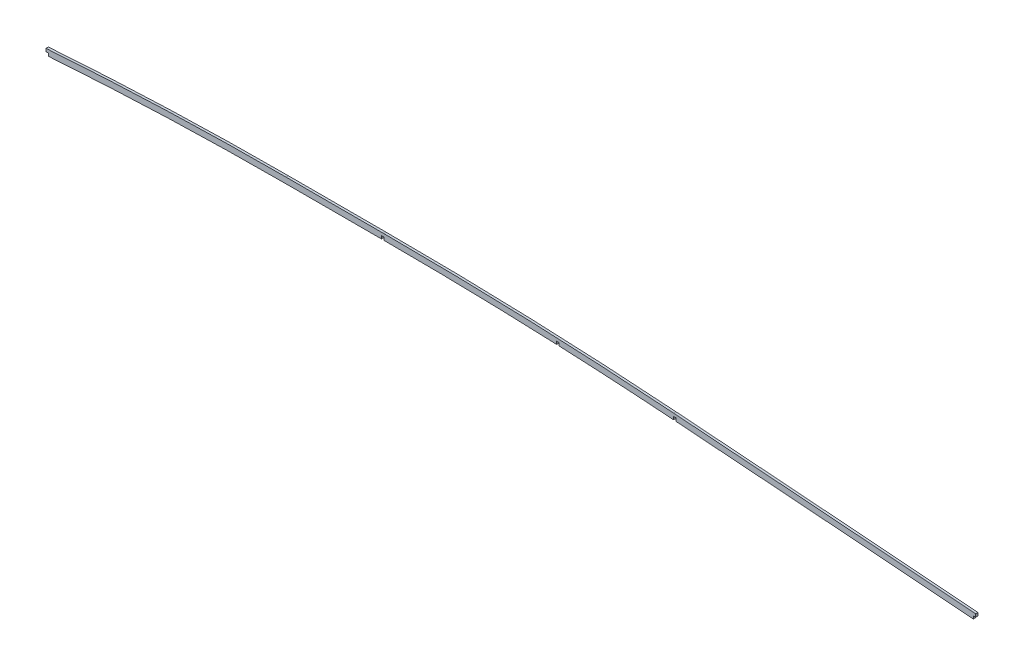
ISO-10303-21;
HEADER;
FILE_DESCRIPTION(('STEP AP214'),'2;1');
FILE_NAME('part.step','',(''),(''),'','','');
FILE_SCHEMA(('AUTOMOTIVE_DESIGN { 1 0 10303 214 1 1 1 1 }'));
ENDSEC;
DATA;
#1=APPLICATION_CONTEXT('core data for automotive mechanical design processes');
#2=APPLICATION_PROTOCOL_DEFINITION('international standard','automotive_design',2000,#1);
#3=PRODUCT_CONTEXT('',#1,'mechanical');
#4=PRODUCT('Part','Part','',(#3));
#5=PRODUCT_RELATED_PRODUCT_CATEGORY('part','',(#4));
#6=PRODUCT_DEFINITION_FORMATION('','',#4);
#7=PRODUCT_DEFINITION_CONTEXT('part definition',#1,'design');
#8=PRODUCT_DEFINITION('design','',#6,#7);
#9=PRODUCT_DEFINITION_SHAPE('','',#8);
#10=(LENGTH_UNIT() NAMED_UNIT(*) SI_UNIT(.MILLI.,.METRE.));
#11=(NAMED_UNIT(*) PLANE_ANGLE_UNIT() SI_UNIT($,.RADIAN.));
#12=(NAMED_UNIT(*) SI_UNIT($,.STERADIAN.) SOLID_ANGLE_UNIT());
#13=UNCERTAINTY_MEASURE_WITH_UNIT(LENGTH_MEASURE(1.E-05),#10,'distance_accuracy_value','');
#14=(GEOMETRIC_REPRESENTATION_CONTEXT(3) GLOBAL_UNCERTAINTY_ASSIGNED_CONTEXT((#13)) GLOBAL_UNIT_ASSIGNED_CONTEXT((#10,
#11,#12)) REPRESENTATION_CONTEXT('',''));
#15=CARTESIAN_POINT('',(0.,0.,0.));
#16=DIRECTION('',(0.,0.,1.));
#17=DIRECTION('',(1.,0.,0.));
#18=AXIS2_PLACEMENT_3D('',#15,#16,#17);
#19=CARTESIAN_POINT('',(418.470256951652,-14187.600562427,10.));
#20=DIRECTION('',(0.,0.,-1.));
#21=DIRECTION('',(-1.,0.,0.));
#22=AXIS2_PLACEMENT_3D('',#19,#20,#21);
#23=CYLINDRICAL_SURFACE('',#22,14481.0488219717);
#24=CARTESIAN_POINT('',(418.470256951652,-14187.600562427,0.));
#25=DIRECTION('',(0.,0.,1.));
#26=DIRECTION('',(1.,0.,0.));
#27=AXIS2_PLACEMENT_3D('',#24,#25,#26);
#28=CIRCLE('',#27,14481.0488219717);
#29=CARTESIAN_POINT('',(418.470256951648,293.448259544728,0.));
#30=VERTEX_POINT('',#29);
#31=CARTESIAN_POINT('',(-598.870505757318,257.668308620742,0.));
#32=VERTEX_POINT('',#31);
#33=EDGE_CURVE('E248',#30,#32,#28,.T.);
#34=ORIENTED_EDGE('',*,*,#33,.F.);
#35=DIRECTION('',(0.,0.,-1.));
#36=VECTOR('',#35,1.);
#37=CARTESIAN_POINT('',(418.470256951648,293.448259544728,10.));
#38=LINE('',#37,#36);
#39=CARTESIAN_POINT('',(418.470256951648,293.448259544728,10.));
#40=VERTEX_POINT('',#39);
#41=EDGE_CURVE('E11',#40,#30,#38,.T.);
#42=ORIENTED_EDGE('',*,*,#41,.F.);
#43=CARTESIAN_POINT('',(418.470256951652,-14187.600562427,10.));
#44=DIRECTION('',(0.,0.,1.));
#45=DIRECTION('',(1.,0.,0.));
#46=AXIS2_PLACEMENT_3D('',#43,#44,#45);
#47=CIRCLE('',#46,14481.0488219717);
#48=CARTESIAN_POINT('',(-598.870505757318,257.668308620742,10.));
#49=VERTEX_POINT('',#48);
#50=EDGE_CURVE('E336',#40,#49,#47,.T.);
#51=ORIENTED_EDGE('',*,*,#50,.T.);
#52=DIRECTION('',(0.,0.,-1.));
#53=VECTOR('',#52,1.);
#54=CARTESIAN_POINT('',(-598.870505757318,257.668308620742,10.));
#55=LINE('',#54,#53);
#56=EDGE_CURVE('E147',#49,#32,#55,.T.);
#57=ORIENTED_EDGE('',*,*,#56,.T.);
#58=EDGE_LOOP('',(#34,#42,#51,#57));
#59=FACE_BOUND('',#58,.T.);
#60=ADVANCED_FACE('F45',(#59),#23,.F.);
#61=CARTESIAN_POINT('',(1.23344609438863E-11,293.448259544746,10.));
#62=DIRECTION('',(0.,1.,0.));
#63=DIRECTION('',(-1.,0.,0.));
#64=AXIS2_PLACEMENT_3D('',#61,#62,#63);
#65=PLANE('',#64);
#66=DIRECTION('',(1.,0.,0.));
#67=VECTOR('',#66,1.);
#68=CARTESIAN_POINT('',(1.23344609438863E-11,293.448259544746,0.));
#69=LINE('',#68,#67);
#70=CARTESIAN_POINT('',(825.799368379474,293.448259544711,0.));
#71=VERTEX_POINT('',#70);
#72=EDGE_CURVE('E252',#30,#71,#69,.T.);
#73=ORIENTED_EDGE('',*,*,#72,.T.);
#74=DIRECTION('',(0.,0.,-1.));
#75=VECTOR('',#74,1.);
#76=CARTESIAN_POINT('',(825.799368379474,293.448259544711,10.));
#77=LINE('',#76,#75);
#78=CARTESIAN_POINT('',(825.799368379474,293.448259544711,10.));
#79=VERTEX_POINT('',#78);
#80=EDGE_CURVE('E54',#79,#71,#77,.T.);
#81=ORIENTED_EDGE('',*,*,#80,.F.);
#82=DIRECTION('',(1.,0.,0.));
#83=VECTOR('',#82,1.);
#84=CARTESIAN_POINT('',(1.23344609438863E-11,293.448259544746,10.));
#85=LINE('',#84,#83);
#86=EDGE_CURVE('E425',#40,#79,#85,.T.);
#87=ORIENTED_EDGE('',*,*,#86,.F.);
#88=ORIENTED_EDGE('',*,*,#41,.T.);
#89=EDGE_LOOP('',(#73,#81,#87,#88));
#90=FACE_BOUND('',#89,.T.);
#91=ADVANCED_FACE('F413',(#90),#65,.F.);
#92=CARTESIAN_POINT('',(825.79936839803,5.11292998792966E-08,10.));
#93=DIRECTION('',(1.,6.19149176372979E-11,0.));
#94=DIRECTION('',(-6.19149176372979E-11,1.,0.));
#95=AXIS2_PLACEMENT_3D('',#92,#93,#94);
#96=PLANE('',#95);
#97=DIRECTION('',(6.19149176372979E-11,-1.,0.));
#98=VECTOR('',#97,1.);
#99=CARTESIAN_POINT('',(825.79936839803,5.11292998792966E-08,0.));
#100=LINE('',#99,#98);
#101=CARTESIAN_POINT('',(825.799368379087,305.948259544709,0.));
#102=VERTEX_POINT('',#101);
#103=EDGE_CURVE('E256',#102,#71,#100,.T.);
#104=ORIENTED_EDGE('',*,*,#103,.F.);
#105=DIRECTION('',(0.,0.,-1.));
#106=VECTOR('',#105,1.);
#107=CARTESIAN_POINT('',(825.799368379087,305.948259544709,10.));
#108=LINE('',#107,#106);
#109=CARTESIAN_POINT('',(825.799368379087,305.948259544709,10.));
#110=VERTEX_POINT('',#109);
#111=EDGE_CURVE('E401',#110,#102,#108,.T.);
#112=ORIENTED_EDGE('',*,*,#111,.F.);
#113=DIRECTION('',(6.19149176372979E-11,-1.,0.));
#114=VECTOR('',#113,1.);
#115=CARTESIAN_POINT('',(825.79936839803,5.11292998792966E-08,10.));
#116=LINE('',#115,#114);
#117=EDGE_CURVE('E410',#110,#79,#116,.T.);
#118=ORIENTED_EDGE('',*,*,#117,.T.);
#119=ORIENTED_EDGE('',*,*,#80,.T.);
#120=EDGE_LOOP('',(#104,#112,#118,#119));
#121=FACE_BOUND('',#120,.T.);
#122=ADVANCED_FACE('F408',(#121),#96,.T.);
#123=CARTESIAN_POINT('',(1.69835401045267E-12,305.948259544714,10.));
#124=DIRECTION('',(0.,-1.,0.));
#125=DIRECTION('',(1.,0.,0.));
#126=AXIS2_PLACEMENT_3D('',#123,#124,#125);
#127=PLANE('',#126);
#128=DIRECTION('',(-1.,0.,0.));
#129=VECTOR('',#128,1.);
#130=CARTESIAN_POINT('',(1.69835401045267E-12,305.948259544714,0.));
#131=LINE('',#130,#129);
#132=CARTESIAN_POINT('',(835.799368379087,305.948259544709,0.));
#133=VERTEX_POINT('',#132);
#134=EDGE_CURVE('E260',#133,#102,#131,.T.);
#135=ORIENTED_EDGE('',*,*,#134,.F.);
#136=DIRECTION('',(0.,0.,-1.));
#137=VECTOR('',#136,1.);
#138=CARTESIAN_POINT('',(835.799368379087,305.948259544709,10.));
#139=LINE('',#138,#137);
#140=CARTESIAN_POINT('',(835.799368379087,305.948259544709,10.));
#141=VERTEX_POINT('',#140);
#142=EDGE_CURVE('E398',#141,#133,#139,.T.);
#143=ORIENTED_EDGE('',*,*,#142,.F.);
#144=DIRECTION('',(-1.,0.,0.));
#145=VECTOR('',#144,1.);
#146=CARTESIAN_POINT('',(1.69835401045267E-12,305.948259544714,10.));
#147=LINE('',#146,#145);
#148=EDGE_CURVE('E422',#141,#110,#147,.T.);
#149=ORIENTED_EDGE('',*,*,#148,.T.);
#150=ORIENTED_EDGE('',*,*,#111,.T.);
#151=EDGE_LOOP('',(#135,#143,#149,#150));
#152=FACE_BOUND('',#151,.T.);
#153=ADVANCED_FACE('F419',(#152),#127,.T.);
#154=CARTESIAN_POINT('',(835.799368416875,1.03229656087279E-07,10.));
#155=DIRECTION('',(-1.,-1.23510091043514E-10,0.));
#156=DIRECTION('',(1.23510091043514E-10,-1.,0.));
#157=AXIS2_PLACEMENT_3D('',#154,#155,#156);
#158=PLANE('',#157);
#159=DIRECTION('',(-1.23510091043514E-10,1.,0.));
#160=VECTOR('',#159,1.);
#161=CARTESIAN_POINT('',(835.799368416875,1.03229656087279E-07,0.));
#162=LINE('',#161,#160);
#163=CARTESIAN_POINT('',(835.799368380631,293.448259544711,0.));
#164=VERTEX_POINT('',#163);
#165=EDGE_CURVE('E264',#164,#133,#162,.T.);
#166=ORIENTED_EDGE('',*,*,#165,.F.);
#167=DIRECTION('',(0.,0.,-1.));
#168=VECTOR('',#167,1.);
#169=CARTESIAN_POINT('',(835.799368380631,293.448259544711,10.));
#170=LINE('',#169,#168);
#171=CARTESIAN_POINT('',(835.799368380631,293.448259544711,10.));
#172=VERTEX_POINT('',#171);
#173=EDGE_CURVE('E395',#172,#164,#170,.T.);
#174=ORIENTED_EDGE('',*,*,#173,.F.);
#175=DIRECTION('',(-1.23510091043514E-10,1.,0.));
#176=VECTOR('',#175,1.);
#177=CARTESIAN_POINT('',(835.799368416875,1.03229656087279E-07,10.));
#178=LINE('',#177,#176);
#179=EDGE_CURVE('E430',#172,#141,#178,.T.);
#180=ORIENTED_EDGE('',*,*,#179,.T.);
#181=ORIENTED_EDGE('',*,*,#142,.T.);
#182=EDGE_LOOP('',(#166,#174,#180,#181));
#183=FACE_BOUND('',#182,.T.);
#184=ADVANCED_FACE('F588',(#183),#158,.T.);
#185=CARTESIAN_POINT('',(835.799368379862,-16684.7350737885,10.));
#186=DIRECTION('',(0.,0.,-1.));
#187=DIRECTION('',(-1.,0.,0.));
#188=AXIS2_PLACEMENT_3D('',#185,#186,#187);
#189=CYLINDRICAL_SURFACE('',#188,16978.1833333332);
#190=CARTESIAN_POINT('',(835.799368379862,-16684.7350737885,0.));
#191=DIRECTION('',(0.,0.,1.));
#192=DIRECTION('',(1.,0.,0.));
#193=AXIS2_PLACEMENT_3D('',#190,#191,#192);
#194=CIRCLE('',#193,16978.1833333332);
#195=CARTESIAN_POINT('',(1574.72865764231,277.360693119072,0.));
#196=VERTEX_POINT('',#195);
#197=EDGE_CURVE('E268',#196,#164,#194,.T.);
#198=ORIENTED_EDGE('',*,*,#197,.F.);
#199=DIRECTION('',(0.,0.,-1.));
#200=VECTOR('',#199,1.);
#201=CARTESIAN_POINT('',(1574.72865764231,277.360693119072,10.));
#202=LINE('',#201,#200);
#203=CARTESIAN_POINT('',(1574.72865764231,277.360693119072,10.));
#204=VERTEX_POINT('',#203);
#205=EDGE_CURVE('E392',#204,#196,#202,.T.);
#206=ORIENTED_EDGE('',*,*,#205,.F.);
#207=CARTESIAN_POINT('',(835.799368379862,-16684.7350737885,10.));
#208=DIRECTION('',(0.,0.,1.));
#209=DIRECTION('',(1.,0.,0.));
#210=AXIS2_PLACEMENT_3D('',#207,#208,#209);
#211=CIRCLE('',#210,16978.1833333332);
#212=EDGE_CURVE('E437',#204,#172,#211,.T.);
#213=ORIENTED_EDGE('',*,*,#212,.T.);
#214=ORIENTED_EDGE('',*,*,#173,.T.);
#215=EDGE_LOOP('',(#198,#206,#213,#214));
#216=FACE_BOUND('',#215,.T.);
#217=ADVANCED_FACE('F584',(#216),#189,.F.);
#218=CARTESIAN_POINT('',(1574.72865766113,1.06865259071871E-07,10.));
#219=DIRECTION('',(1.,6.78626495758278E-11,0.));
#220=DIRECTION('',(-6.78626495758278E-11,1.,0.));
#221=AXIS2_PLACEMENT_3D('',#218,#219,#220);
#222=PLANE('',#221);
#223=DIRECTION('',(6.78626495758278E-11,-1.,0.));
#224=VECTOR('',#223,1.);
#225=CARTESIAN_POINT('',(1574.72865766113,1.06865259071871E-07,0.));
#226=LINE('',#225,#224);
#227=CARTESIAN_POINT('',(1574.72865764149,289.43426521351,0.));
#228=VERTEX_POINT('',#227);
#229=EDGE_CURVE('E272',#228,#196,#226,.T.);
#230=ORIENTED_EDGE('',*,*,#229,.F.);
#231=DIRECTION('',(0.,0.,-1.));
#232=VECTOR('',#231,1.);
#233=CARTESIAN_POINT('',(1574.72865764149,289.43426521351,10.));
#234=LINE('',#233,#232);
#235=CARTESIAN_POINT('',(1574.72865764149,289.43426521351,10.));
#236=VERTEX_POINT('',#235);
#237=EDGE_CURVE('E389',#236,#228,#234,.T.);
#238=ORIENTED_EDGE('',*,*,#237,.F.);
#239=DIRECTION('',(6.78626495758278E-11,-1.,0.));
#240=VECTOR('',#239,1.);
#241=CARTESIAN_POINT('',(1574.72865766113,1.06865259071871E-07,10.));
#242=LINE('',#241,#240);
#243=EDGE_CURVE('E441',#236,#204,#242,.T.);
#244=ORIENTED_EDGE('',*,*,#243,.T.);
#245=ORIENTED_EDGE('',*,*,#205,.T.);
#246=EDGE_LOOP('',(#230,#238,#244,#245));
#247=FACE_BOUND('',#246,.T.);
#248=ADVANCED_FACE('F580',(#247),#222,.T.);
#249=CARTESIAN_POINT('',(0.,289.43426521351,10.));
#250=DIRECTION('',(0.,-1.,0.));
#251=DIRECTION('',(0.,0.,-1.));
#252=AXIS2_PLACEMENT_3D('',#249,#250,#251);
#253=PLANE('',#252);
#254=DIRECTION('',(-1.,0.,0.));
#255=VECTOR('',#254,1.);
#256=CARTESIAN_POINT('',(0.,289.43426521351,0.));
#257=LINE('',#256,#255);
#258=CARTESIAN_POINT('',(1584.72865764149,289.43426521351,0.));
#259=VERTEX_POINT('',#258);
#260=EDGE_CURVE('E276',#259,#228,#257,.T.);
#261=ORIENTED_EDGE('',*,*,#260,.F.);
#262=DIRECTION('',(0.,0.,-1.));
#263=VECTOR('',#262,1.);
#264=CARTESIAN_POINT('',(1584.72865764149,289.43426521351,10.));
#265=LINE('',#264,#263);
#266=CARTESIAN_POINT('',(1584.72865764149,289.43426521351,10.));
#267=VERTEX_POINT('',#266);
#268=EDGE_CURVE('E386',#267,#259,#265,.T.);
#269=ORIENTED_EDGE('',*,*,#268,.F.);
#270=DIRECTION('',(-1.,0.,0.));
#271=VECTOR('',#270,1.);
#272=CARTESIAN_POINT('',(0.,289.43426521351,10.));
#273=LINE('',#272,#271);
#274=EDGE_CURVE('E445',#267,#236,#273,.T.);
#275=ORIENTED_EDGE('',*,*,#274,.T.);
#276=ORIENTED_EDGE('',*,*,#237,.T.);
#277=EDGE_LOOP('',(#261,#269,#275,#276));
#278=FACE_BOUND('',#277,.T.);
#279=ADVANCED_FACE('F576',(#278),#253,.T.);
#280=CARTESIAN_POINT('',(1584.72865764149,0.,10.));
#281=DIRECTION('',(1.,0.,0.));
#282=DIRECTION('',(0.,0.,-1.));
#283=AXIS2_PLACEMENT_3D('',#280,#281,#282);
#284=PLANE('',#283);
#285=DIRECTION('',(0.,-1.,0.));
#286=VECTOR('',#285,1.);
#287=CARTESIAN_POINT('',(1584.72865764149,0.,0.));
#288=LINE('',#287,#286);
#289=CARTESIAN_POINT('',(1584.72865764149,276.922104092396,0.));
#290=VERTEX_POINT('',#289);
#291=EDGE_CURVE('E280',#259,#290,#288,.T.);
#292=ORIENTED_EDGE('',*,*,#291,.T.);
#293=DIRECTION('',(0.,0.,-1.));
#294=VECTOR('',#293,1.);
#295=CARTESIAN_POINT('',(1584.72865764149,276.922104092396,10.));
#296=LINE('',#295,#294);
#297=CARTESIAN_POINT('',(1584.72865764149,276.922104092396,10.));
#298=VERTEX_POINT('',#297);
#299=EDGE_CURVE('E383',#298,#290,#296,.T.);
#300=ORIENTED_EDGE('',*,*,#299,.F.);
#301=DIRECTION('',(0.,-1.,0.));
#302=VECTOR('',#301,1.);
#303=CARTESIAN_POINT('',(1584.72865764149,0.,10.));
#304=LINE('',#303,#302);
#305=EDGE_CURVE('E449',#267,#298,#304,.T.);
#306=ORIENTED_EDGE('',*,*,#305,.F.);
#307=ORIENTED_EDGE('',*,*,#268,.T.);
#308=EDGE_LOOP('',(#292,#300,#306,#307));
#309=FACE_BOUND('',#308,.T.);
#310=ADVANCED_FACE('F572',(#309),#284,.F.);
#311=CARTESIAN_POINT('',(835.799368379862,-16684.7350737885,10.));
#312=DIRECTION('',(0.,0.,-1.));
#313=DIRECTION('',(-1.,0.,0.));
#314=AXIS2_PLACEMENT_3D('',#311,#312,#313);
#315=CYLINDRICAL_SURFACE('',#314,16978.1833333332);
#316=CARTESIAN_POINT('',(835.799368379862,-16684.7350737885,0.));
#317=DIRECTION('',(0.,0.,1.));
#318=DIRECTION('',(1.,0.,0.));
#319=AXIS2_PLACEMENT_3D('',#316,#317,#318);
#320=CIRCLE('',#319,16978.1833333332);
#321=CARTESIAN_POINT('',(2072.90704391126,248.317630889858,0.));
#322=VERTEX_POINT('',#321);
#323=EDGE_CURVE('E284',#322,#290,#320,.T.);
#324=ORIENTED_EDGE('',*,*,#323,.F.);
#325=DIRECTION('',(0.,0.,-1.));
#326=VECTOR('',#325,1.);
#327=CARTESIAN_POINT('',(2072.90704391126,248.317630889858,10.));
#328=LINE('',#327,#326);
#329=CARTESIAN_POINT('',(2072.90704391126,248.317630889858,10.));
#330=VERTEX_POINT('',#329);
#331=EDGE_CURVE('E380',#330,#322,#328,.T.);
#332=ORIENTED_EDGE('',*,*,#331,.F.);
#333=CARTESIAN_POINT('',(835.799368379862,-16684.7350737885,10.));
#334=DIRECTION('',(0.,0.,1.));
#335=DIRECTION('',(1.,0.,0.));
#336=AXIS2_PLACEMENT_3D('',#333,#334,#335);
#337=CIRCLE('',#336,16978.1833333332);
#338=EDGE_CURVE('E452',#330,#298,#337,.T.);
#339=ORIENTED_EDGE('',*,*,#338,.T.);
#340=ORIENTED_EDGE('',*,*,#299,.T.);
#341=EDGE_LOOP('',(#324,#332,#339,#340));
#342=FACE_BOUND('',#341,.T.);
#343=ADVANCED_FACE('F569',(#342),#315,.F.);
#344=CARTESIAN_POINT('',(-17442.8335690952,-266875.612570998,10.));
#345=DIRECTION('',(0.,0.,-1.));
#346=DIRECTION('',(-1.,0.,0.));
#347=AXIS2_PLACEMENT_3D('',#344,#345,#346);
#348=CYLINDRICAL_SURFACE('',#347,267835.879258507);
#349=CARTESIAN_POINT('',(-17442.8335690952,-266875.612570998,0.));
#350=DIRECTION('',(0.,0.,1.));
#351=DIRECTION('',(1.,0.,0.));
#352=AXIS2_PLACEMENT_3D('',#349,#350,#351);
#353=CIRCLE('',#352,267835.879258507);
#354=CARTESIAN_POINT('',(2074.72865764231,248.18453982215,0.));
#355=VERTEX_POINT('',#354);
#356=EDGE_CURVE('E288',#322,#355,#353,.F.);
#357=ORIENTED_EDGE('',*,*,#356,.T.);
#358=DIRECTION('',(0.,0.,-1.));
#359=VECTOR('',#358,1.);
#360=CARTESIAN_POINT('',(2074.72865764231,248.18453982215,10.));
#361=LINE('',#360,#359);
#362=CARTESIAN_POINT('',(2074.72865764231,248.18453982215,10.));
#363=VERTEX_POINT('',#362);
#364=EDGE_CURVE('E376',#363,#355,#361,.T.);
#365=ORIENTED_EDGE('',*,*,#364,.F.);
#366=CARTESIAN_POINT('',(-17442.8335690952,-266875.612570998,10.));
#367=DIRECTION('',(0.,0.,1.));
#368=DIRECTION('',(1.,0.,0.));
#369=AXIS2_PLACEMENT_3D('',#366,#367,#368);
#370=CIRCLE('',#369,267835.879258507);
#371=EDGE_CURVE('E456',#330,#363,#370,.F.);
#372=ORIENTED_EDGE('',*,*,#371,.F.);
#373=ORIENTED_EDGE('',*,*,#331,.T.);
#374=EDGE_LOOP('',(#357,#365,#372,#373));
#375=FACE_BOUND('',#374,.T.);
#376=ADVANCED_FACE('F557',(#375),#348,.F.);
#377=CARTESIAN_POINT('',(2074.72865765855,1.3577228896268E-07,10.));
#378=DIRECTION('',(-1.,-6.544098596291E-11,0.));
#379=DIRECTION('',(6.544098596291E-11,-1.,0.));
#380=AXIS2_PLACEMENT_3D('',#377,#378,#379);
#381=PLANE('',#380);
#382=DIRECTION('',(-6.544098596291E-11,1.,0.));
#383=VECTOR('',#382,1.);
#384=CARTESIAN_POINT('',(2074.72865765855,1.3577228896268E-07,0.));
#385=LINE('',#384,#383);
#386=CARTESIAN_POINT('',(2074.72865764149,260.684539822264,0.));
#387=VERTEX_POINT('',#386);
#388=EDGE_CURVE('E291',#355,#387,#385,.T.);
#389=ORIENTED_EDGE('',*,*,#388,.T.);
#390=DIRECTION('',(0.,0.,-1.));
#391=VECTOR('',#390,1.);
#392=CARTESIAN_POINT('',(2074.72865764149,260.684539822264,10.));
#393=LINE('',#392,#391);
#394=CARTESIAN_POINT('',(2074.72865764149,260.684539822264,10.));
#395=VERTEX_POINT('',#394);
#396=EDGE_CURVE('E372',#395,#387,#393,.T.);
#397=ORIENTED_EDGE('',*,*,#396,.F.);
#398=DIRECTION('',(-6.544098596291E-11,1.,0.));
#399=VECTOR('',#398,1.);
#400=CARTESIAN_POINT('',(2074.72865765855,1.3577228896268E-07,10.));
#401=LINE('',#400,#399);
#402=EDGE_CURVE('E459',#363,#395,#401,.T.);
#403=ORIENTED_EDGE('',*,*,#402,.F.);
#404=ORIENTED_EDGE('',*,*,#364,.T.);
#405=EDGE_LOOP('',(#389,#397,#403,#404));
#406=FACE_BOUND('',#405,.T.);
#407=ADVANCED_FACE('F564',(#406),#381,.F.);
#408=CARTESIAN_POINT('',(0.,260.684539822264,10.));
#409=DIRECTION('',(0.,1.,0.));
#410=DIRECTION('',(0.,0.,1.));
#411=AXIS2_PLACEMENT_3D('',#408,#409,#410);
#412=PLANE('',#411);
#413=DIRECTION('',(1.,0.,0.));
#414=VECTOR('',#413,1.);
#415=CARTESIAN_POINT('',(0.,260.684539822264,0.));
#416=LINE('',#415,#414);
#417=CARTESIAN_POINT('',(2084.72865764149,260.684539822264,0.));
#418=VERTEX_POINT('',#417);
#419=EDGE_CURVE('E295',#387,#418,#416,.T.);
#420=ORIENTED_EDGE('',*,*,#419,.T.);
#421=DIRECTION('',(0.,0.,-1.));
#422=VECTOR('',#421,1.);
#423=CARTESIAN_POINT('',(2084.72865764149,260.684539822264,10.));
#424=LINE('',#423,#422);
#425=CARTESIAN_POINT('',(2084.72865764149,260.684539822264,10.));
#426=VERTEX_POINT('',#425);
#427=EDGE_CURVE('E368',#426,#418,#424,.T.);
#428=ORIENTED_EDGE('',*,*,#427,.F.);
#429=DIRECTION('',(1.,0.,0.));
#430=VECTOR('',#429,1.);
#431=CARTESIAN_POINT('',(0.,260.684539822264,10.));
#432=LINE('',#431,#430);
#433=EDGE_CURVE('E463',#395,#426,#432,.T.);
#434=ORIENTED_EDGE('',*,*,#433,.F.);
#435=ORIENTED_EDGE('',*,*,#396,.T.);
#436=EDGE_LOOP('',(#420,#428,#434,#435));
#437=FACE_BOUND('',#436,.T.);
#438=ADVANCED_FACE('F560',(#437),#412,.F.);
#439=CARTESIAN_POINT('',(2084.72865765764,1.29170665596263E-07,10.));
#440=DIRECTION('',(1.,6.19604211424791E-11,0.));
#441=DIRECTION('',(-6.19604211424791E-11,1.,0.));
#442=AXIS2_PLACEMENT_3D('',#439,#440,#441);
#443=PLANE('',#442);
#444=DIRECTION('',(6.19604211424791E-11,-1.,0.));
#445=VECTOR('',#444,1.);
#446=CARTESIAN_POINT('',(2084.72865765764,1.29170665596263E-07,0.));
#447=LINE('',#446,#445);
#448=CARTESIAN_POINT('',(2084.72865764231,247.453695579,0.));
#449=VERTEX_POINT('',#448);
#450=EDGE_CURVE('E298',#418,#449,#447,.T.);
#451=ORIENTED_EDGE('',*,*,#450,.T.);
#452=DIRECTION('',(0.,0.,-1.));
#453=VECTOR('',#452,1.);
#454=CARTESIAN_POINT('',(2084.72865764231,247.453695579,10.));
#455=LINE('',#454,#453);
#456=CARTESIAN_POINT('',(2084.72865764231,247.453695579,10.));
#457=VERTEX_POINT('',#456);
#458=EDGE_CURVE('E364',#457,#449,#455,.T.);
#459=ORIENTED_EDGE('',*,*,#458,.F.);
#460=DIRECTION('',(6.19604211424791E-11,-1.,0.));
#461=VECTOR('',#460,1.);
#462=CARTESIAN_POINT('',(2084.72865765764,1.29170665596263E-07,10.));
#463=LINE('',#462,#461);
#464=EDGE_CURVE('E466',#426,#457,#463,.T.);
#465=ORIENTED_EDGE('',*,*,#464,.F.);
#466=ORIENTED_EDGE('',*,*,#427,.T.);
#467=EDGE_LOOP('',(#451,#459,#465,#466));
#468=FACE_BOUND('',#467,.T.);
#469=ADVANCED_FACE('F556',(#468),#443,.F.);
#470=CARTESIAN_POINT('',(3356.54974816061,151.434508130424,0.));
#471=VERTEX_POINT('',#470);
#472=EDGE_CURVE('E292',#449,#471,#353,.F.);
#473=ORIENTED_EDGE('',*,*,#472,.T.);
#474=DIRECTION('',(0.,0.,-1.));
#475=VECTOR('',#474,1.);
#476=CARTESIAN_POINT('',(3356.54974816061,151.434508130424,10.));
#477=LINE('',#476,#475);
#478=CARTESIAN_POINT('',(3356.54974816061,151.434508130424,10.));
#479=VERTEX_POINT('',#478);
#480=EDGE_CURVE('E361',#479,#471,#477,.T.);
#481=ORIENTED_EDGE('',*,*,#480,.F.);
#482=EDGE_CURVE('E460',#457,#479,#370,.F.);
#483=ORIENTED_EDGE('',*,*,#482,.F.);
#484=ORIENTED_EDGE('',*,*,#458,.T.);
#485=EDGE_LOOP('',(#473,#481,#483,#484));
#486=FACE_BOUND('',#485,.T.);
#487=ADVANCED_FACE('F522',(#486),#348,.F.);
#488=CARTESIAN_POINT('',(3356.54974816061,0.,10.));
#489=DIRECTION('',(1.,0.,0.));
#490=DIRECTION('',(0.,0.,-1.));
#491=AXIS2_PLACEMENT_3D('',#488,#489,#490);
#492=PLANE('',#491);
#493=DIRECTION('',(0.,-1.,0.));
#494=VECTOR('',#493,1.);
#495=CARTESIAN_POINT('',(3356.54974816061,0.,0.));
#496=LINE('',#495,#494);
#497=CARTESIAN_POINT('',(3356.54974816061,163.193291399722,0.));
#498=VERTEX_POINT('',#497);
#499=EDGE_CURVE('E301',#498,#471,#496,.T.);
#500=ORIENTED_EDGE('',*,*,#499,.F.);
#501=DIRECTION('',(0.,0.,-1.));
#502=VECTOR('',#501,1.);
#503=CARTESIAN_POINT('',(3356.54974816061,163.193291399722,10.));
#504=LINE('',#503,#502);
#505=CARTESIAN_POINT('',(3356.54974816061,163.193291399722,10.));
#506=VERTEX_POINT('',#505);
#507=EDGE_CURVE('E358',#506,#498,#504,.T.);
#508=ORIENTED_EDGE('',*,*,#507,.F.);
#509=DIRECTION('',(0.,-1.,0.));
#510=VECTOR('',#509,1.);
#511=CARTESIAN_POINT('',(3356.54974816061,0.,10.));
#512=LINE('',#511,#510);
#513=EDGE_CURVE('E469',#506,#479,#512,.T.);
#514=ORIENTED_EDGE('',*,*,#513,.T.);
#515=ORIENTED_EDGE('',*,*,#480,.T.);
#516=EDGE_LOOP('',(#500,#508,#514,#515));
#517=FACE_BOUND('',#516,.T.);
#518=ADVANCED_FACE('F530',(#517),#492,.T.);
#519=CARTESIAN_POINT('',(0.,163.193291399722,10.));
#520=DIRECTION('',(0.,-1.,0.));
#521=DIRECTION('',(0.,0.,-1.));
#522=AXIS2_PLACEMENT_3D('',#519,#520,#521);
#523=PLANE('',#522);
#524=DIRECTION('',(-1.,0.,0.));
#525=VECTOR('',#524,1.);
#526=CARTESIAN_POINT('',(0.,163.193291399722,0.));
#527=LINE('',#526,#525);
#528=CARTESIAN_POINT('',(3366.54974816062,163.193291399722,0.));
#529=VERTEX_POINT('',#528);
#530=EDGE_CURVE('E305',#529,#498,#527,.T.);
#531=ORIENTED_EDGE('',*,*,#530,.F.);
#532=DIRECTION('',(0.,0.,-1.));
#533=VECTOR('',#532,1.);
#534=CARTESIAN_POINT('',(3366.54974816062,163.193291399722,10.));
#535=LINE('',#534,#533);
#536=CARTESIAN_POINT('',(3366.54974816062,163.193291399722,10.));
#537=VERTEX_POINT('',#536);
#538=EDGE_CURVE('E355',#537,#529,#535,.T.);
#539=ORIENTED_EDGE('',*,*,#538,.F.);
#540=DIRECTION('',(-1.,0.,0.));
#541=VECTOR('',#540,1.);
#542=CARTESIAN_POINT('',(0.,163.193291399722,10.));
#543=LINE('',#542,#541);
#544=EDGE_CURVE('E473',#537,#506,#543,.T.);
#545=ORIENTED_EDGE('',*,*,#544,.T.);
#546=ORIENTED_EDGE('',*,*,#507,.T.);
#547=EDGE_LOOP('',(#531,#539,#545,#546));
#548=FACE_BOUND('',#547,.T.);
#549=ADVANCED_FACE('F534',(#548),#523,.T.);
#550=CARTESIAN_POINT('',(3366.54974816062,0.,10.));
#551=DIRECTION('',(-1.,0.,0.));
#552=DIRECTION('',(0.,0.,1.));
#553=AXIS2_PLACEMENT_3D('',#550,#551,#552);
#554=PLANE('',#553);
#555=DIRECTION('',(0.,1.,0.));
#556=VECTOR('',#555,1.);
#557=CARTESIAN_POINT('',(3366.54974816062,0.,0.));
#558=LINE('',#557,#556);
#559=CARTESIAN_POINT('',(3366.54974816062,175.731187268127,0.));
#560=VERTEX_POINT('',#559);
#561=EDGE_CURVE('E309',#529,#560,#558,.T.);
#562=ORIENTED_EDGE('',*,*,#561,.T.);
#563=DIRECTION('',(0.,0.,-1.));
#564=VECTOR('',#563,1.);
#565=CARTESIAN_POINT('',(3366.54974816062,175.731187268127,10.));
#566=LINE('',#565,#564);
#567=CARTESIAN_POINT('',(3366.54974816062,175.731187268127,10.));
#568=VERTEX_POINT('',#567);
#569=EDGE_CURVE('E352',#568,#560,#566,.T.);
#570=ORIENTED_EDGE('',*,*,#569,.F.);
#571=DIRECTION('',(0.,1.,0.));
#572=VECTOR('',#571,1.);
#573=CARTESIAN_POINT('',(3366.54974816062,0.,10.));
#574=LINE('',#573,#572);
#575=EDGE_CURVE('E477',#537,#568,#574,.T.);
#576=ORIENTED_EDGE('',*,*,#575,.F.);
#577=ORIENTED_EDGE('',*,*,#538,.T.);
#578=EDGE_LOOP('',(#562,#570,#576,#577));
#579=FACE_BOUND('',#578,.T.);
#580=ADVANCED_FACE('F538',(#579),#554,.F.);
#581=CARTESIAN_POINT('',(-17442.8335690952,-266875.612570998,10.));
#582=DIRECTION('',(0.,0.,-1.));
#583=DIRECTION('',(-1.,0.,0.));
#584=AXIS2_PLACEMENT_3D('',#581,#582,#583);
#585=CYLINDRICAL_SURFACE('',#584,267860.879258507);
#586=CARTESIAN_POINT('',(-17442.8335690952,-266875.612570998,0.));
#587=DIRECTION('',(0.,0.,1.));
#588=DIRECTION('',(1.,0.,0.));
#589=AXIS2_PLACEMENT_3D('',#586,#587,#588);
#590=CIRCLE('',#589,267860.879258507);
#591=CARTESIAN_POINT('',(2074.72865764233,273.251177036059,0.));
#592=VERTEX_POINT('',#591);
#593=EDGE_CURVE('E313',#592,#560,#590,.F.);
#594=ORIENTED_EDGE('',*,*,#593,.F.);
#595=DIRECTION('',(0.,0.,-1.));
#596=VECTOR('',#595,1.);
#597=CARTESIAN_POINT('',(2074.72865764233,273.251177036059,10.));
#598=LINE('',#597,#596);
#599=CARTESIAN_POINT('',(2074.72865764233,273.251177036059,10.));
#600=VERTEX_POINT('',#599);
#601=EDGE_CURVE('E349',#600,#592,#598,.T.);
#602=ORIENTED_EDGE('',*,*,#601,.F.);
#603=CARTESIAN_POINT('',(-17442.8335690952,-266875.612570998,10.));
#604=DIRECTION('',(0.,0.,1.));
#605=DIRECTION('',(1.,0.,0.));
#606=AXIS2_PLACEMENT_3D('',#603,#604,#605);
#607=CIRCLE('',#606,267860.879258507);
#608=EDGE_CURVE('E480',#600,#568,#607,.F.);
#609=ORIENTED_EDGE('',*,*,#608,.T.);
#610=ORIENTED_EDGE('',*,*,#569,.T.);
#611=EDGE_LOOP('',(#594,#602,#609,#610));
#612=FACE_BOUND('',#611,.T.);
#613=ADVANCED_FACE('F540',(#612),#585,.T.);
#614=CARTESIAN_POINT('',(835.799368379862,-16684.7350737885,10.));
#615=DIRECTION('',(0.,0.,-1.));
#616=DIRECTION('',(-1.,0.,0.));
#617=AXIS2_PLACEMENT_3D('',#614,#615,#616);
#618=CYLINDRICAL_SURFACE('',#617,17003.1833333333);
#619=CARTESIAN_POINT('',(835.799368379862,-16684.7350737885,0.));
#620=DIRECTION('',(0.,0.,1.));
#621=DIRECTION('',(1.,0.,0.));
#622=AXIS2_PLACEMENT_3D('',#619,#620,#621);
#623=CIRCLE('',#622,17003.1833333333);
#624=CARTESIAN_POINT('',(835.799368379863,318.44825954482,0.));
#625=VERTEX_POINT('',#624);
#626=EDGE_CURVE('E317',#592,#625,#623,.T.);
#627=ORIENTED_EDGE('',*,*,#626,.T.);
#628=DIRECTION('',(0.,0.,-1.));
#629=VECTOR('',#628,1.);
#630=CARTESIAN_POINT('',(835.799368379863,318.44825954482,10.));
#631=LINE('',#630,#629);
#632=CARTESIAN_POINT('',(835.799368379863,318.44825954482,10.));
#633=VERTEX_POINT('',#632);
#634=EDGE_CURVE('E346',#633,#625,#631,.T.);
#635=ORIENTED_EDGE('',*,*,#634,.F.);
#636=CARTESIAN_POINT('',(835.799368379862,-16684.7350737885,10.));
#637=DIRECTION('',(0.,0.,1.));
#638=DIRECTION('',(1.,0.,0.));
#639=AXIS2_PLACEMENT_3D('',#636,#637,#638);
#640=CIRCLE('',#639,17003.1833333333);
#641=EDGE_CURVE('E484',#600,#633,#640,.T.);
#642=ORIENTED_EDGE('',*,*,#641,.F.);
#643=ORIENTED_EDGE('',*,*,#601,.T.);
#644=EDGE_LOOP('',(#627,#635,#642,#643));
#645=FACE_BOUND('',#644,.T.);
#646=ADVANCED_FACE('F495',(#645),#618,.T.);
#647=CARTESIAN_POINT('',(-7.62452755379736E-13,318.448259544817,10.));
#648=DIRECTION('',(0.,1.,0.));
#649=DIRECTION('',(-1.,0.,0.));
#650=AXIS2_PLACEMENT_3D('',#647,#648,#649);
#651=PLANE('',#650);
#652=DIRECTION('',(1.,0.,0.));
#653=VECTOR('',#652,1.);
#654=CARTESIAN_POINT('',(-7.62452755379736E-13,318.448259544817,0.));
#655=LINE('',#654,#653);
#656=CARTESIAN_POINT('',(418.470256951651,318.448259544818,0.));
#657=VERTEX_POINT('',#656);
#658=EDGE_CURVE('E321',#657,#625,#655,.T.);
#659=ORIENTED_EDGE('',*,*,#658,.F.);
#660=DIRECTION('',(0.,0.,-1.));
#661=VECTOR('',#660,1.);
#662=CARTESIAN_POINT('',(418.470256951651,318.448259544818,10.));
#663=LINE('',#662,#661);
#664=CARTESIAN_POINT('',(418.470256951651,318.448259544818,10.));
#665=VERTEX_POINT('',#664);
#666=EDGE_CURVE('E343',#665,#657,#663,.T.);
#667=ORIENTED_EDGE('',*,*,#666,.F.);
#668=DIRECTION('',(1.,0.,0.));
#669=VECTOR('',#668,1.);
#670=CARTESIAN_POINT('',(-7.62452755379736E-13,318.448259544817,10.));
#671=LINE('',#670,#669);
#672=EDGE_CURVE('E242',#665,#633,#671,.T.);
#673=ORIENTED_EDGE('',*,*,#672,.T.);
#674=ORIENTED_EDGE('',*,*,#634,.T.);
#675=EDGE_LOOP('',(#659,#667,#673,#674));
#676=FACE_BOUND('',#675,.T.);
#677=ADVANCED_FACE('F490',(#676),#651,.T.);
#678=CARTESIAN_POINT('',(418.470256951652,-14187.600562427,10.));
#679=DIRECTION('',(0.,0.,-1.));
#680=DIRECTION('',(-1.,0.,0.));
#681=AXIS2_PLACEMENT_3D('',#678,#679,#680);
#682=CYLINDRICAL_SURFACE('',#681,14506.0488219718);
#683=CARTESIAN_POINT('',(418.470256951652,-14187.600562427,0.));
#684=DIRECTION('',(0.,0.,1.));
#685=DIRECTION('',(1.,0.,0.));
#686=AXIS2_PLACEMENT_3D('',#683,#684,#685);
#687=CIRCLE('',#686,14506.0488219718);
#688=CARTESIAN_POINT('',(-608.870505757318,282.023599337027,0.));
#689=VERTEX_POINT('',#688);
#690=EDGE_CURVE('E325',#657,#689,#687,.T.);
#691=ORIENTED_EDGE('',*,*,#690,.T.);
#692=DIRECTION('',(0.,0.,-1.));
#693=VECTOR('',#692,1.);
#694=CARTESIAN_POINT('',(-608.870505757318,282.023599337027,10.));
#695=LINE('',#694,#693);
#696=CARTESIAN_POINT('',(-608.870505757318,282.023599337027,10.));
#697=VERTEX_POINT('',#696);
#698=EDGE_CURVE('E227',#697,#689,#695,.T.);
#699=ORIENTED_EDGE('',*,*,#698,.F.);
#700=CARTESIAN_POINT('',(418.470256951652,-14187.600562427,10.));
#701=DIRECTION('',(0.,0.,1.));
#702=DIRECTION('',(1.,0.,0.));
#703=AXIS2_PLACEMENT_3D('',#700,#701,#702);
#704=CIRCLE('',#703,14506.0488219718);
#705=EDGE_CURVE('E237',#665,#697,#704,.T.);
#706=ORIENTED_EDGE('',*,*,#705,.F.);
#707=ORIENTED_EDGE('',*,*,#666,.T.);
#708=EDGE_LOOP('',(#691,#699,#706,#707));
#709=FACE_BOUND('',#708,.T.);
#710=ADVANCED_FACE('F500',(#709),#682,.T.);
#711=CARTESIAN_POINT('',(-608.870505757318,0.,10.));
#712=DIRECTION('',(-1.,0.,0.));
#713=DIRECTION('',(0.,0.,1.));
#714=AXIS2_PLACEMENT_3D('',#711,#712,#713);
#715=PLANE('',#714);
#716=DIRECTION('',(0.,1.,0.));
#717=VECTOR('',#716,1.);
#718=CARTESIAN_POINT('',(-608.870505757318,0.,0.));
#719=LINE('',#718,#717);
#720=CARTESIAN_POINT('',(-608.870505757318,269.49207831986,0.));
#721=VERTEX_POINT('',#720);
#722=EDGE_CURVE('E225',#721,#689,#719,.T.);
#723=ORIENTED_EDGE('',*,*,#722,.F.);
#724=DIRECTION('',(0.,0.,-1.));
#725=VECTOR('',#724,1.);
#726=CARTESIAN_POINT('',(-608.870505757318,269.49207831986,10.));
#727=LINE('',#726,#725);
#728=CARTESIAN_POINT('',(-608.870505757318,269.49207831986,10.));
#729=VERTEX_POINT('',#728);
#730=EDGE_CURVE('E219',#729,#721,#727,.T.);
#731=ORIENTED_EDGE('',*,*,#730,.F.);
#732=DIRECTION('',(0.,1.,0.));
#733=VECTOR('',#732,1.);
#734=CARTESIAN_POINT('',(-608.870505757318,0.,10.));
#735=LINE('',#734,#733);
#736=EDGE_CURVE('E223',#729,#697,#735,.T.);
#737=ORIENTED_EDGE('',*,*,#736,.T.);
#738=ORIENTED_EDGE('',*,*,#698,.T.);
#739=EDGE_LOOP('',(#723,#731,#737,#738));
#740=FACE_BOUND('',#739,.T.);
#741=ADVANCED_FACE('F221',(#740),#715,.T.);
#742=CARTESIAN_POINT('',(0.,269.49207831986,10.));
#743=DIRECTION('',(0.,1.,0.));
#744=DIRECTION('',(0.,0.,1.));
#745=AXIS2_PLACEMENT_3D('',#742,#743,#744);
#746=PLANE('',#745);
#747=DIRECTION('',(1.,0.,0.));
#748=VECTOR('',#747,1.);
#749=CARTESIAN_POINT('',(0.,269.49207831986,0.));
#750=LINE('',#749,#748);
#751=CARTESIAN_POINT('',(-598.870505757318,269.49207831986,0.));
#752=VERTEX_POINT('',#751);
#753=EDGE_CURVE('E140',#721,#752,#750,.T.);
#754=ORIENTED_EDGE('',*,*,#753,.T.);
#755=DIRECTION('',(0.,0.,-1.));
#756=VECTOR('',#755,1.);
#757=CARTESIAN_POINT('',(-598.870505757318,269.49207831986,10.));
#758=LINE('',#757,#756);
#759=CARTESIAN_POINT('',(-598.870505757318,269.49207831986,10.));
#760=VERTEX_POINT('',#759);
#761=EDGE_CURVE('E228',#760,#752,#758,.T.);
#762=ORIENTED_EDGE('',*,*,#761,.F.);
#763=DIRECTION('',(1.,0.,0.));
#764=VECTOR('',#763,1.);
#765=CARTESIAN_POINT('',(0.,269.49207831986,10.));
#766=LINE('',#765,#764);
#767=EDGE_CURVE('E230',#729,#760,#766,.T.);
#768=ORIENTED_EDGE('',*,*,#767,.F.);
#769=ORIENTED_EDGE('',*,*,#730,.T.);
#770=EDGE_LOOP('',(#754,#762,#768,#769));
#771=FACE_BOUND('',#770,.T.);
#772=ADVANCED_FACE('F231',(#771),#746,.F.);
#773=CARTESIAN_POINT('',(-598.870505757318,0.,10.));
#774=DIRECTION('',(1.,0.,0.));
#775=DIRECTION('',(0.,0.,-1.));
#776=AXIS2_PLACEMENT_3D('',#773,#774,#775);
#777=PLANE('',#776);
#778=DIRECTION('',(0.,-1.,0.));
#779=VECTOR('',#778,1.);
#780=CARTESIAN_POINT('',(-598.870505757318,0.,0.));
#781=LINE('',#780,#779);
#782=EDGE_CURVE('E333',#752,#32,#781,.T.);
#783=ORIENTED_EDGE('',*,*,#782,.T.);
#784=ORIENTED_EDGE('',*,*,#56,.F.);
#785=DIRECTION('',(0.,-1.,0.));
#786=VECTOR('',#785,1.);
#787=CARTESIAN_POINT('',(-598.870505757318,0.,10.));
#788=LINE('',#787,#786);
#789=EDGE_CURVE('E62',#760,#49,#788,.T.);
#790=ORIENTED_EDGE('',*,*,#789,.F.);
#791=ORIENTED_EDGE('',*,*,#761,.T.);
#792=EDGE_LOOP('',(#783,#784,#790,#791));
#793=FACE_BOUND('',#792,.T.);
#794=ADVANCED_FACE('F515',(#793),#777,.F.);
#795=CARTESIAN_POINT('',(0.,0.,10.));
#796=DIRECTION('',(0.,0.,1.));
#797=DIRECTION('',(1.,0.,0.));
#798=AXIS2_PLACEMENT_3D('',#795,#796,#797);
#799=PLANE('',#798);
#800=ORIENTED_EDGE('',*,*,#50,.F.);
#801=ORIENTED_EDGE('',*,*,#86,.T.);
#802=ORIENTED_EDGE('',*,*,#117,.F.);
#803=ORIENTED_EDGE('',*,*,#148,.F.);
#804=ORIENTED_EDGE('',*,*,#179,.F.);
#805=ORIENTED_EDGE('',*,*,#212,.F.);
#806=ORIENTED_EDGE('',*,*,#243,.F.);
#807=ORIENTED_EDGE('',*,*,#274,.F.);
#808=ORIENTED_EDGE('',*,*,#305,.T.);
#809=ORIENTED_EDGE('',*,*,#338,.F.);
#810=ORIENTED_EDGE('',*,*,#371,.T.);
#811=ORIENTED_EDGE('',*,*,#402,.T.);
#812=ORIENTED_EDGE('',*,*,#433,.T.);
#813=ORIENTED_EDGE('',*,*,#464,.T.);
#814=ORIENTED_EDGE('',*,*,#482,.T.);
#815=ORIENTED_EDGE('',*,*,#513,.F.);
#816=ORIENTED_EDGE('',*,*,#544,.F.);
#817=ORIENTED_EDGE('',*,*,#575,.T.);
#818=ORIENTED_EDGE('',*,*,#608,.F.);
#819=ORIENTED_EDGE('',*,*,#641,.T.);
#820=ORIENTED_EDGE('',*,*,#672,.F.);
#821=ORIENTED_EDGE('',*,*,#705,.T.);
#822=ORIENTED_EDGE('',*,*,#736,.F.);
#823=ORIENTED_EDGE('',*,*,#767,.T.);
#824=ORIENTED_EDGE('',*,*,#789,.T.);
#825=EDGE_LOOP('',(#800,#801,#802,#803,#804,#805,#806,#807,#808,#809,#810,#811,#812,#813,#814,
#815,#816,#817,#818,#819,#820,#821,#822,#823,#824));
#826=FACE_BOUND('',#825,.T.);
#827=ADVANCED_FACE('F234',(#826),#799,.T.);
#828=CARTESIAN_POINT('',(0.,0.,0.));
#829=DIRECTION('',(0.,0.,1.));
#830=DIRECTION('',(1.,0.,0.));
#831=AXIS2_PLACEMENT_3D('',#828,#829,#830);
#832=PLANE('',#831);
#833=ORIENTED_EDGE('',*,*,#33,.T.);
#834=ORIENTED_EDGE('',*,*,#782,.F.);
#835=ORIENTED_EDGE('',*,*,#753,.F.);
#836=ORIENTED_EDGE('',*,*,#722,.T.);
#837=ORIENTED_EDGE('',*,*,#690,.F.);
#838=ORIENTED_EDGE('',*,*,#658,.T.);
#839=ORIENTED_EDGE('',*,*,#626,.F.);
#840=ORIENTED_EDGE('',*,*,#593,.T.);
#841=ORIENTED_EDGE('',*,*,#561,.F.);
#842=ORIENTED_EDGE('',*,*,#530,.T.);
#843=ORIENTED_EDGE('',*,*,#499,.T.);
#844=ORIENTED_EDGE('',*,*,#472,.F.);
#845=ORIENTED_EDGE('',*,*,#450,.F.);
#846=ORIENTED_EDGE('',*,*,#419,.F.);
#847=ORIENTED_EDGE('',*,*,#388,.F.);
#848=ORIENTED_EDGE('',*,*,#356,.F.);
#849=ORIENTED_EDGE('',*,*,#323,.T.);
#850=ORIENTED_EDGE('',*,*,#291,.F.);
#851=ORIENTED_EDGE('',*,*,#260,.T.);
#852=ORIENTED_EDGE('',*,*,#229,.T.);
#853=ORIENTED_EDGE('',*,*,#197,.T.);
#854=ORIENTED_EDGE('',*,*,#165,.T.);
#855=ORIENTED_EDGE('',*,*,#134,.T.);
#856=ORIENTED_EDGE('',*,*,#103,.T.);
#857=ORIENTED_EDGE('',*,*,#72,.F.);
#858=EDGE_LOOP('',(#833,#834,#835,#836,#837,#838,#839,#840,#841,#842,#843,#844,#845,#846,#847,
#848,#849,#850,#851,#852,#853,#854,#855,#856,#857));
#859=FACE_BOUND('',#858,.T.);
#860=ADVANCED_FACE('F415',(#859),#832,.F.);
#861=CLOSED_SHELL('',(#60,#91,#122,#153,#184,#217,#248,#279,#310,#343,#376,#407,#438,#469,#487,
#518,#549,#580,#613,#646,#677,#710,#741,#772,#794,#827,#860));
#862=MANIFOLD_SOLID_BREP('B2',#861);
#863=ADVANCED_BREP_SHAPE_REPRESENTATION('',(#18,#862),#14);
#864=SHAPE_DEFINITION_REPRESENTATION(#9,#863);
ENDSEC;
END-ISO-10303-21;
